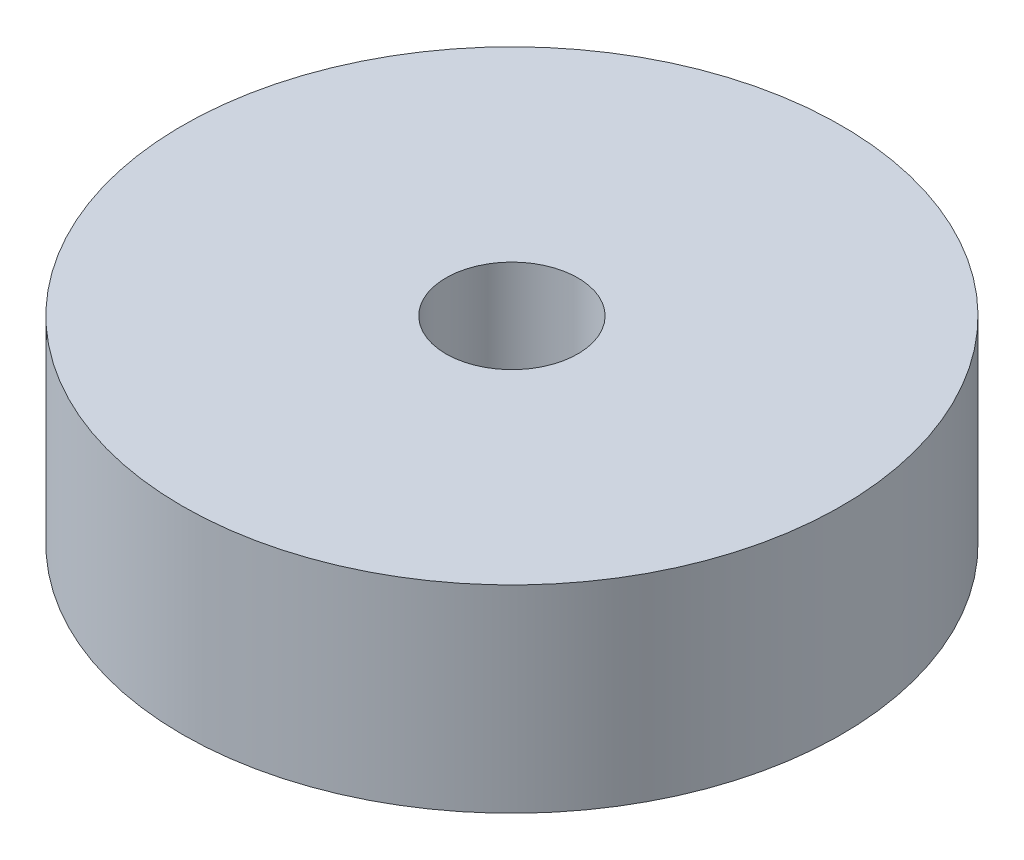
ISO-10303-21;
HEADER;
FILE_DESCRIPTION(('STEP AP214'),'2;1');
FILE_NAME('part.step','',(''),(''),'','','');
FILE_SCHEMA(('AUTOMOTIVE_DESIGN { 1 0 10303 214 1 1 1 1 }'));
ENDSEC;
DATA;
#1=APPLICATION_CONTEXT('core data for automotive mechanical design processes');
#2=APPLICATION_PROTOCOL_DEFINITION('international standard','automotive_design',2000,#1);
#3=PRODUCT_CONTEXT('',#1,'mechanical');
#4=PRODUCT('Part','Part','',(#3));
#5=PRODUCT_RELATED_PRODUCT_CATEGORY('part','',(#4));
#6=PRODUCT_DEFINITION_FORMATION('','',#4);
#7=PRODUCT_DEFINITION_CONTEXT('part definition',#1,'design');
#8=PRODUCT_DEFINITION('design','',#6,#7);
#9=PRODUCT_DEFINITION_SHAPE('','',#8);
#10=(LENGTH_UNIT() NAMED_UNIT(*) SI_UNIT(.MILLI.,.METRE.));
#11=(NAMED_UNIT(*) PLANE_ANGLE_UNIT() SI_UNIT($,.RADIAN.));
#12=(NAMED_UNIT(*) SI_UNIT($,.STERADIAN.) SOLID_ANGLE_UNIT());
#13=UNCERTAINTY_MEASURE_WITH_UNIT(LENGTH_MEASURE(1.E-05),#10,'distance_accuracy_value','');
#14=(GEOMETRIC_REPRESENTATION_CONTEXT(3) GLOBAL_UNCERTAINTY_ASSIGNED_CONTEXT((#13)) GLOBAL_UNIT_ASSIGNED_CONTEXT((#10,
#11,#12)) REPRESENTATION_CONTEXT('',''));
#15=CARTESIAN_POINT('',(0.,0.,0.));
#16=DIRECTION('',(0.,0.,1.));
#17=DIRECTION('',(1.,0.,0.));
#18=AXIS2_PLACEMENT_3D('',#15,#16,#17);
#19=CARTESIAN_POINT('',(0.,9.,0.));
#20=DIRECTION('',(0.,1.,0.));
#21=DIRECTION('',(0.,0.,1.));
#22=AXIS2_PLACEMENT_3D('',#19,#20,#21);
#23=PLANE('',#22);
#24=CARTESIAN_POINT('',(0.,9.,0.));
#25=DIRECTION('',(0.,1.,0.));
#26=DIRECTION('',(0.,0.,1.));
#27=AXIS2_PLACEMENT_3D('',#24,#25,#26);
#28=CIRCLE('',#27,15.);
#29=CARTESIAN_POINT('',(0.,9.,15.));
#30=VERTEX_POINT('',#29);
#31=EDGE_CURVE('E10',#30,#30,#28,.T.);
#32=ORIENTED_EDGE('',*,*,#31,.T.);
#33=EDGE_LOOP('',(#32));
#34=FACE_BOUND('',#33,.T.);
#35=CARTESIAN_POINT('',(0.,9.,0.));
#36=DIRECTION('',(0.,1.,0.));
#37=DIRECTION('',(0.,0.,1.));
#38=AXIS2_PLACEMENT_3D('',#35,#36,#37);
#39=CIRCLE('',#38,3.);
#40=CARTESIAN_POINT('',(0.,9.,3.));
#41=VERTEX_POINT('',#40);
#42=EDGE_CURVE('E54',#41,#41,#39,.T.);
#43=ORIENTED_EDGE('',*,*,#42,.F.);
#44=EDGE_LOOP('',(#43));
#45=FACE_BOUND('',#44,.T.);
#46=ADVANCED_FACE('F41',(#34,#45),#23,.T.);
#47=CARTESIAN_POINT('',(0.,0.,0.));
#48=DIRECTION('',(0.,1.,0.));
#49=DIRECTION('',(0.,0.,1.));
#50=AXIS2_PLACEMENT_3D('',#47,#48,#49);
#51=PLANE('',#50);
#52=CARTESIAN_POINT('',(0.,0.,0.));
#53=DIRECTION('',(0.,1.,0.));
#54=DIRECTION('',(0.,0.,1.));
#55=AXIS2_PLACEMENT_3D('',#52,#53,#54);
#56=CIRCLE('',#55,15.);
#57=CARTESIAN_POINT('',(0.,0.,15.));
#58=VERTEX_POINT('',#57);
#59=EDGE_CURVE('E45',#58,#58,#56,.T.);
#60=ORIENTED_EDGE('',*,*,#59,.F.);
#61=EDGE_LOOP('',(#60));
#62=FACE_BOUND('',#61,.T.);
#63=CARTESIAN_POINT('',(0.,0.,0.));
#64=DIRECTION('',(0.,1.,0.));
#65=DIRECTION('',(0.,0.,1.));
#66=AXIS2_PLACEMENT_3D('',#63,#64,#65);
#67=CIRCLE('',#66,3.);
#68=CARTESIAN_POINT('',(0.,0.,3.));
#69=VERTEX_POINT('',#68);
#70=EDGE_CURVE('E56',#69,#69,#67,.T.);
#71=ORIENTED_EDGE('',*,*,#70,.T.);
#72=EDGE_LOOP('',(#71));
#73=FACE_BOUND('',#72,.T.);
#74=ADVANCED_FACE('F68',(#62,#73),#51,.F.);
#75=CARTESIAN_POINT('',(0.,9.,0.));
#76=DIRECTION('',(0.,-1.,0.));
#77=DIRECTION('',(0.,0.,-1.));
#78=AXIS2_PLACEMENT_3D('',#75,#76,#77);
#79=CYLINDRICAL_SURFACE('',#78,15.);
#80=ORIENTED_EDGE('',*,*,#31,.F.);
#81=EDGE_LOOP('',(#80));
#82=FACE_BOUND('',#81,.T.);
#83=ORIENTED_EDGE('',*,*,#59,.T.);
#84=EDGE_LOOP('',(#83));
#85=FACE_BOUND('',#84,.T.);
#86=ADVANCED_FACE('F43',(#82,#85),#79,.T.);
#87=CARTESIAN_POINT('',(0.,9.,0.));
#88=DIRECTION('',(0.,-1.,0.));
#89=DIRECTION('',(0.,0.,-1.));
#90=AXIS2_PLACEMENT_3D('',#87,#88,#89);
#91=CYLINDRICAL_SURFACE('',#90,3.);
#92=ORIENTED_EDGE('',*,*,#42,.T.);
#93=EDGE_LOOP('',(#92));
#94=FACE_BOUND('',#93,.T.);
#95=ORIENTED_EDGE('',*,*,#70,.F.);
#96=EDGE_LOOP('',(#95));
#97=FACE_BOUND('',#96,.T.);
#98=ADVANCED_FACE('F64',(#94,#97),#91,.F.);
#99=CLOSED_SHELL('',(#46,#74,#86,#98));
#100=MANIFOLD_SOLID_BREP('B2',#99);
#101=ADVANCED_BREP_SHAPE_REPRESENTATION('',(#18,#100),#14);
#102=SHAPE_DEFINITION_REPRESENTATION(#9,#101);
ENDSEC;
END-ISO-10303-21;
